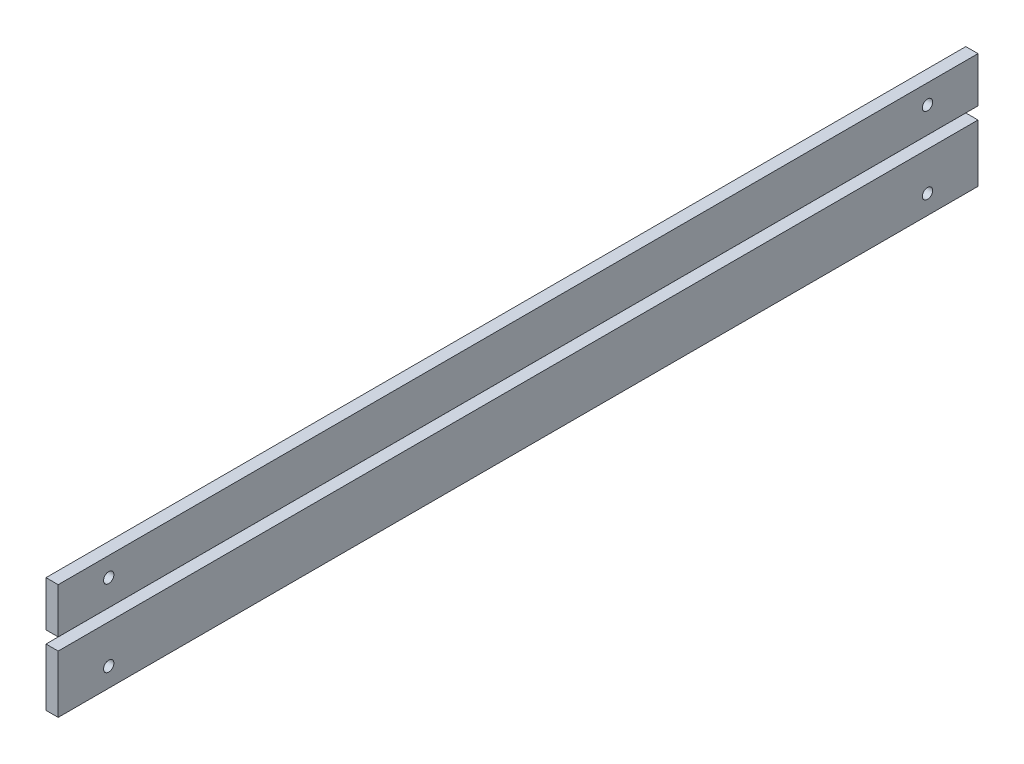
ISO-10303-21;
HEADER;
FILE_DESCRIPTION(('STEP AP214'),'2;1');
FILE_NAME('part.step','',(''),(''),'','','');
FILE_SCHEMA(('AUTOMOTIVE_DESIGN { 1 0 10303 214 1 1 1 1 }'));
ENDSEC;
DATA;
#1=APPLICATION_CONTEXT('core data for automotive mechanical design processes');
#2=APPLICATION_PROTOCOL_DEFINITION('international standard','automotive_design',2000,#1);
#3=PRODUCT_CONTEXT('',#1,'mechanical');
#4=PRODUCT('Part','Part','',(#3));
#5=PRODUCT_RELATED_PRODUCT_CATEGORY('part','',(#4));
#6=PRODUCT_DEFINITION_FORMATION('','',#4);
#7=PRODUCT_DEFINITION_CONTEXT('part definition',#1,'design');
#8=PRODUCT_DEFINITION('design','',#6,#7);
#9=PRODUCT_DEFINITION_SHAPE('','',#8);
#10=(LENGTH_UNIT() NAMED_UNIT(*) SI_UNIT(.MILLI.,.METRE.));
#11=(NAMED_UNIT(*) PLANE_ANGLE_UNIT() SI_UNIT($,.RADIAN.));
#12=(NAMED_UNIT(*) SI_UNIT($,.STERADIAN.) SOLID_ANGLE_UNIT());
#13=UNCERTAINTY_MEASURE_WITH_UNIT(LENGTH_MEASURE(1.E-05),#10,'distance_accuracy_value','');
#14=(GEOMETRIC_REPRESENTATION_CONTEXT(3) GLOBAL_UNCERTAINTY_ASSIGNED_CONTEXT((#13)) GLOBAL_UNIT_ASSIGNED_CONTEXT((#10,
#11,#12)) REPRESENTATION_CONTEXT('',''));
#15=CARTESIAN_POINT('',(0.,0.,0.));
#16=DIRECTION('',(0.,0.,1.));
#17=DIRECTION('',(1.,0.,0.));
#18=AXIS2_PLACEMENT_3D('',#15,#16,#17);
#19=CARTESIAN_POINT('',(3.18,15.,-120.));
#20=DIRECTION('',(0.,0.,1.));
#21=DIRECTION('',(1.,0.,0.));
#22=AXIS2_PLACEMENT_3D('',#19,#20,#21);
#23=PLANE('',#22);
#24=DIRECTION('',(0.,1.,0.));
#25=VECTOR('',#24,1.);
#26=CARTESIAN_POINT('',(3.18,15.,-120.));
#27=LINE('',#26,#25);
#28=CARTESIAN_POINT('',(3.18,3.19,-120.));
#29=VERTEX_POINT('',#28);
#30=CARTESIAN_POINT('',(3.18,15.,-120.));
#31=VERTEX_POINT('',#30);
#32=EDGE_CURVE('E93',#29,#31,#27,.T.);
#33=ORIENTED_EDGE('',*,*,#32,.F.);
#34=DIRECTION('',(1.,0.,0.));
#35=VECTOR('',#34,1.);
#36=CARTESIAN_POINT('',(-6.82,3.19,-120.));
#37=LINE('',#36,#35);
#38=CARTESIAN_POINT('',(0.,3.19,-120.));
#39=VERTEX_POINT('',#38);
#40=EDGE_CURVE('E55',#39,#29,#37,.T.);
#41=ORIENTED_EDGE('',*,*,#40,.F.);
#42=DIRECTION('',(0.,1.,0.));
#43=VECTOR('',#42,1.);
#44=CARTESIAN_POINT('',(0.,15.,-120.));
#45=LINE('',#44,#43);
#46=CARTESIAN_POINT('',(0.,15.,-120.));
#47=VERTEX_POINT('',#46);
#48=EDGE_CURVE('E49',#39,#47,#45,.T.);
#49=ORIENTED_EDGE('',*,*,#48,.T.);
#50=DIRECTION('',(-1.,0.,0.));
#51=VECTOR('',#50,1.);
#52=CARTESIAN_POINT('',(3.18,15.,-120.));
#53=LINE('',#52,#51);
#54=EDGE_CURVE('E102',#31,#47,#53,.T.);
#55=ORIENTED_EDGE('',*,*,#54,.F.);
#56=EDGE_LOOP('',(#33,#41,#49,#55));
#57=FACE_BOUND('',#56,.T.);
#58=ADVANCED_FACE('F46',(#57),#23,.F.);
#59=CARTESIAN_POINT('',(3.18,15.,120.));
#60=DIRECTION('',(0.,0.,-1.));
#61=DIRECTION('',(-1.,0.,0.));
#62=AXIS2_PLACEMENT_3D('',#59,#60,#61);
#63=PLANE('',#62);
#64=DIRECTION('',(0.,-1.,0.));
#65=VECTOR('',#64,1.);
#66=CARTESIAN_POINT('',(0.,15.,120.));
#67=LINE('',#66,#65);
#68=CARTESIAN_POINT('',(0.,15.,120.));
#69=VERTEX_POINT('',#68);
#70=CARTESIAN_POINT('',(0.,3.19,120.));
#71=VERTEX_POINT('',#70);
#72=EDGE_CURVE('E125',#69,#71,#67,.T.);
#73=ORIENTED_EDGE('',*,*,#72,.T.);
#74=DIRECTION('',(1.,0.,0.));
#75=VECTOR('',#74,1.);
#76=CARTESIAN_POINT('',(-6.82,3.19,120.));
#77=LINE('',#76,#75);
#78=CARTESIAN_POINT('',(3.18,3.19,120.));
#79=VERTEX_POINT('',#78);
#80=EDGE_CURVE('E114',#71,#79,#77,.T.);
#81=ORIENTED_EDGE('',*,*,#80,.T.);
#82=DIRECTION('',(0.,-1.,0.));
#83=VECTOR('',#82,1.);
#84=CARTESIAN_POINT('',(3.18,15.,120.));
#85=LINE('',#84,#83);
#86=CARTESIAN_POINT('',(3.18,15.,120.));
#87=VERTEX_POINT('',#86);
#88=EDGE_CURVE('E104',#87,#79,#85,.T.);
#89=ORIENTED_EDGE('',*,*,#88,.F.);
#90=DIRECTION('',(-1.,0.,0.));
#91=VECTOR('',#90,1.);
#92=CARTESIAN_POINT('',(3.18,15.,120.));
#93=LINE('',#92,#91);
#94=EDGE_CURVE('E99',#87,#69,#93,.T.);
#95=ORIENTED_EDGE('',*,*,#94,.T.);
#96=EDGE_LOOP('',(#73,#81,#89,#95));
#97=FACE_BOUND('',#96,.T.);
#98=ADVANCED_FACE('F130',(#97),#63,.F.);
#99=CARTESIAN_POINT('',(3.18,0.,0.));
#100=DIRECTION('',(1.,0.,0.));
#101=DIRECTION('',(0.,0.,-1.));
#102=AXIS2_PLACEMENT_3D('',#99,#100,#101);
#103=PLANE('',#102);
#104=DIRECTION('',(0.,0.,1.));
#105=VECTOR('',#104,1.);
#106=CARTESIAN_POINT('',(3.18,3.19,120.));
#107=LINE('',#106,#105);
#108=EDGE_CURVE('E12',#29,#79,#107,.T.);
#109=ORIENTED_EDGE('',*,*,#108,.F.);
#110=ORIENTED_EDGE('',*,*,#32,.T.);
#111=DIRECTION('',(0.,0.,1.));
#112=VECTOR('',#111,1.);
#113=CARTESIAN_POINT('',(3.18,15.,120.));
#114=LINE('',#113,#112);
#115=EDGE_CURVE('E98',#31,#87,#114,.T.);
#116=ORIENTED_EDGE('',*,*,#115,.T.);
#117=ORIENTED_EDGE('',*,*,#88,.T.);
#118=EDGE_LOOP('',(#109,#110,#116,#117));
#119=FACE_BOUND('',#118,.T.);
#120=CARTESIAN_POINT('',(3.18,10.,-106.82));
#121=DIRECTION('',(1.,0.,0.));
#122=DIRECTION('',(0.,0.,-1.));
#123=AXIS2_PLACEMENT_3D('',#120,#121,#122);
#124=CIRCLE('',#123,1.35000000000001);
#125=CARTESIAN_POINT('',(3.18,10.,-105.47));
#126=VERTEX_POINT('',#125);
#127=EDGE_CURVE('E116',#126,#126,#124,.F.);
#128=ORIENTED_EDGE('',*,*,#127,.T.);
#129=EDGE_LOOP('',(#128));
#130=FACE_BOUND('',#129,.T.);
#131=CARTESIAN_POINT('',(3.18,10.,106.82));
#132=DIRECTION('',(1.,0.,0.));
#133=DIRECTION('',(0.,0.,-1.));
#134=AXIS2_PLACEMENT_3D('',#131,#132,#133);
#135=CIRCLE('',#134,1.35000000000001);
#136=CARTESIAN_POINT('',(3.18,10.,108.17));
#137=VERTEX_POINT('',#136);
#138=EDGE_CURVE('E109',#137,#137,#135,.T.);
#139=ORIENTED_EDGE('',*,*,#138,.F.);
#140=EDGE_LOOP('',(#139));
#141=FACE_BOUND('',#140,.T.);
#142=ADVANCED_FACE('F95',(#119,#130,#141),#103,.T.);
#143=CARTESIAN_POINT('',(0.,0.,0.));
#144=DIRECTION('',(1.,0.,0.));
#145=DIRECTION('',(0.,0.,-1.));
#146=AXIS2_PLACEMENT_3D('',#143,#144,#145);
#147=PLANE('',#146);
#148=CARTESIAN_POINT('',(0.,10.,-106.82));
#149=DIRECTION('',(-1.,0.,0.));
#150=DIRECTION('',(0.,0.,1.));
#151=AXIS2_PLACEMENT_3D('',#148,#149,#150);
#152=CIRCLE('',#151,1.35000000000001);
#153=CARTESIAN_POINT('',(0.,10.,-105.47));
#154=VERTEX_POINT('',#153);
#155=EDGE_CURVE('E106',#154,#154,#152,.T.);
#156=ORIENTED_EDGE('',*,*,#155,.F.);
#157=EDGE_LOOP('',(#156));
#158=FACE_BOUND('',#157,.T.);
#159=CARTESIAN_POINT('',(0.,10.,106.82));
#160=DIRECTION('',(1.,0.,0.));
#161=DIRECTION('',(0.,0.,-1.));
#162=AXIS2_PLACEMENT_3D('',#159,#160,#161);
#163=CIRCLE('',#162,1.35000000000001);
#164=CARTESIAN_POINT('',(0.,10.,108.17));
#165=VERTEX_POINT('',#164);
#166=EDGE_CURVE('E118',#165,#165,#163,.T.);
#167=ORIENTED_EDGE('',*,*,#166,.T.);
#168=EDGE_LOOP('',(#167));
#169=FACE_BOUND('',#168,.T.);
#170=ORIENTED_EDGE('',*,*,#48,.F.);
#171=DIRECTION('',(0.,0.,1.));
#172=VECTOR('',#171,1.);
#173=CARTESIAN_POINT('',(0.,3.19,0.));
#174=LINE('',#173,#172);
#175=EDGE_CURVE('E64',#39,#71,#174,.T.);
#176=ORIENTED_EDGE('',*,*,#175,.T.);
#177=ORIENTED_EDGE('',*,*,#72,.F.);
#178=DIRECTION('',(0.,0.,1.));
#179=VECTOR('',#178,1.);
#180=CARTESIAN_POINT('',(0.,15.,120.));
#181=LINE('',#180,#179);
#182=EDGE_CURVE('E81',#47,#69,#181,.T.);
#183=ORIENTED_EDGE('',*,*,#182,.F.);
#184=EDGE_LOOP('',(#170,#176,#177,#183));
#185=FACE_BOUND('',#184,.T.);
#186=ADVANCED_FACE('F132',(#158,#169,#185),#147,.F.);
#187=CARTESIAN_POINT('',(3.18,15.,120.));
#188=DIRECTION('',(0.,-1.,0.));
#189=DIRECTION('',(0.,0.,-1.));
#190=AXIS2_PLACEMENT_3D('',#187,#188,#189);
#191=PLANE('',#190);
#192=ORIENTED_EDGE('',*,*,#182,.T.);
#193=ORIENTED_EDGE('',*,*,#94,.F.);
#194=ORIENTED_EDGE('',*,*,#115,.F.);
#195=ORIENTED_EDGE('',*,*,#54,.T.);
#196=EDGE_LOOP('',(#192,#193,#194,#195));
#197=FACE_BOUND('',#196,.T.);
#198=ADVANCED_FACE('F101',(#197),#191,.F.);
#199=CARTESIAN_POINT('',(3.181,10.,-106.82));
#200=DIRECTION('',(-1.,0.,0.));
#201=DIRECTION('',(0.,0.,1.));
#202=AXIS2_PLACEMENT_3D('',#199,#200,#201);
#203=CYLINDRICAL_SURFACE('',#202,1.35000000000001);
#204=CARTESIAN_POINT('',(3.18,10.,-105.47));
#205=CARTESIAN_POINT('',(3.146875,10.,-105.47));
#206=CARTESIAN_POINT('',(3.11375,10.,-105.47));
#207=CARTESIAN_POINT('',(3.0475,10.,-105.47));
#208=CARTESIAN_POINT('',(3.014375,10.,-105.47));
#209=CARTESIAN_POINT('',(2.948125,10.,-105.47));
#210=CARTESIAN_POINT('',(2.915,10.,-105.47));
#211=CARTESIAN_POINT('',(2.84875,10.,-105.47));
#212=CARTESIAN_POINT('',(2.815625,10.,-105.47));
#213=CARTESIAN_POINT('',(2.749375,10.,-105.47));
#214=CARTESIAN_POINT('',(2.71625,10.,-105.47));
#215=CARTESIAN_POINT('',(2.65,10.,-105.47));
#216=CARTESIAN_POINT('',(2.616875,10.,-105.47));
#217=CARTESIAN_POINT('',(2.550625,10.,-105.47));
#218=CARTESIAN_POINT('',(2.5175,10.,-105.47));
#219=CARTESIAN_POINT('',(2.45125,10.,-105.47));
#220=CARTESIAN_POINT('',(2.418125,10.,-105.47));
#221=CARTESIAN_POINT('',(2.351875,10.,-105.47));
#222=CARTESIAN_POINT('',(2.31875,10.,-105.47));
#223=CARTESIAN_POINT('',(2.2525,10.,-105.47));
#224=CARTESIAN_POINT('',(2.219375,10.,-105.47));
#225=CARTESIAN_POINT('',(2.153125,10.,-105.47));
#226=CARTESIAN_POINT('',(2.12,10.,-105.47));
#227=CARTESIAN_POINT('',(2.05375,10.,-105.47));
#228=CARTESIAN_POINT('',(2.020625,10.,-105.47));
#229=CARTESIAN_POINT('',(1.954375,10.,-105.47));
#230=CARTESIAN_POINT('',(1.92125,10.,-105.47));
#231=CARTESIAN_POINT('',(1.855,10.,-105.47));
#232=CARTESIAN_POINT('',(1.821875,10.,-105.47));
#233=CARTESIAN_POINT('',(1.755625,10.,-105.47));
#234=CARTESIAN_POINT('',(1.7225,10.,-105.47));
#235=CARTESIAN_POINT('',(1.65625,10.,-105.47));
#236=CARTESIAN_POINT('',(1.623125,10.,-105.47));
#237=CARTESIAN_POINT('',(1.556875,10.,-105.47));
#238=CARTESIAN_POINT('',(1.52375,10.,-105.47));
#239=CARTESIAN_POINT('',(1.4575,10.,-105.47));
#240=CARTESIAN_POINT('',(1.424375,10.,-105.47));
#241=CARTESIAN_POINT('',(1.358125,10.,-105.47));
#242=CARTESIAN_POINT('',(1.325,10.,-105.47));
#243=CARTESIAN_POINT('',(1.25875,10.,-105.47));
#244=CARTESIAN_POINT('',(1.225625,10.,-105.47));
#245=CARTESIAN_POINT('',(1.159375,10.,-105.47));
#246=CARTESIAN_POINT('',(1.12625,10.,-105.47));
#247=CARTESIAN_POINT('',(1.06,10.,-105.47));
#248=CARTESIAN_POINT('',(1.026875,10.,-105.47));
#249=CARTESIAN_POINT('',(0.960625,10.,-105.47));
#250=CARTESIAN_POINT('',(0.9275,10.,-105.47));
#251=CARTESIAN_POINT('',(0.86125,10.,-105.47));
#252=CARTESIAN_POINT('',(0.828125,10.,-105.47));
#253=CARTESIAN_POINT('',(0.761875,10.,-105.47));
#254=CARTESIAN_POINT('',(0.72875,10.,-105.47));
#255=CARTESIAN_POINT('',(0.6625,10.,-105.47));
#256=CARTESIAN_POINT('',(0.629375,10.,-105.47));
#257=CARTESIAN_POINT('',(0.563125,10.,-105.47));
#258=CARTESIAN_POINT('',(0.53,10.,-105.47));
#259=CARTESIAN_POINT('',(0.46375,10.,-105.47));
#260=CARTESIAN_POINT('',(0.430625,10.,-105.47));
#261=CARTESIAN_POINT('',(0.364375,10.,-105.47));
#262=CARTESIAN_POINT('',(0.33125,10.,-105.47));
#263=CARTESIAN_POINT('',(0.265,10.,-105.47));
#264=CARTESIAN_POINT('',(0.231875,10.,-105.47));
#265=CARTESIAN_POINT('',(0.165625,10.,-105.47));
#266=CARTESIAN_POINT('',(0.1325,10.,-105.47));
#267=CARTESIAN_POINT('',(0.0662499999999998,10.,-105.47));
#268=CARTESIAN_POINT('',(0.0331249999999999,10.,-105.47));
#269=CARTESIAN_POINT('',(0.,10.,-105.47));
#270=B_SPLINE_CURVE_WITH_KNOTS('',3,(#204,#205,#206,#207,#208,#209,#210,#211,#212,#213,#214,
#215,#216,#217,#218,#219,#220,#221,#222,#223,#224,#225,#226,#227,#228,#229,#230,#231,#232,#233,
#234,#235,#236,#237,#238,#239,#240,#241,#242,#243,#244,#245,#246,#247,#248,#249,#250,#251,#252,
#253,#254,#255,#256,#257,#258,#259,#260,#261,#262,#263,#264,#265,#266,#267,#268,#269),
.UNSPECIFIED.,.F.,.F.,(4,2,2,2,2,2,2,2,2,2,2,2,2,2,2,2,2,2,2,2,2,2,2,2,2,2,2,2,2,2,2,2,4),(0.,
0.0993750000000001,0.19875,0.298125,0.3975,0.496875,0.59625,0.695625,0.795,0.894375,0.99375,
1.093125,1.1925,1.291875,1.39125,1.490625,1.59,1.689375,1.78875,1.888125,1.9875,2.086875,
2.18625,2.285625,2.385,2.484375,2.58375,2.683125,2.7825,2.881875,2.98125,3.080625,3.18),.UNSPECIFIED.);
#271=EDGE_CURVE('BSEAM140',#126,#154,#270,.T.);
#272=ORIENTED_EDGE('',*,*,#127,.F.);
#273=ORIENTED_EDGE('',*,*,#155,.T.);
#274=ORIENTED_EDGE('',*,*,#271,.T.);
#275=ORIENTED_EDGE('',*,*,#271,.F.);
#276=EDGE_LOOP('',(#272,#274,#273,#275));
#277=FACE_BOUND('',#276,.T.);
#278=ADVANCED_FACE('F140',(#277),#203,.F.);
#279=CARTESIAN_POINT('',(3.181,10.,106.82));
#280=DIRECTION('',(-1.,0.,0.));
#281=DIRECTION('',(0.,0.,1.));
#282=AXIS2_PLACEMENT_3D('',#279,#280,#281);
#283=CYLINDRICAL_SURFACE('',#282,1.35000000000001);
#284=CARTESIAN_POINT('',(3.18,10.,108.17));
#285=CARTESIAN_POINT('',(3.146875,10.,108.17));
#286=CARTESIAN_POINT('',(3.11375,10.,108.17));
#287=CARTESIAN_POINT('',(3.0475,10.,108.17));
#288=CARTESIAN_POINT('',(3.014375,10.,108.17));
#289=CARTESIAN_POINT('',(2.948125,10.,108.17));
#290=CARTESIAN_POINT('',(2.915,10.,108.17));
#291=CARTESIAN_POINT('',(2.84875,10.,108.17));
#292=CARTESIAN_POINT('',(2.815625,10.,108.17));
#293=CARTESIAN_POINT('',(2.749375,10.,108.17));
#294=CARTESIAN_POINT('',(2.71625,10.,108.17));
#295=CARTESIAN_POINT('',(2.65,10.,108.17));
#296=CARTESIAN_POINT('',(2.616875,10.,108.17));
#297=CARTESIAN_POINT('',(2.550625,10.,108.17));
#298=CARTESIAN_POINT('',(2.5175,10.,108.17));
#299=CARTESIAN_POINT('',(2.45125,10.,108.17));
#300=CARTESIAN_POINT('',(2.418125,10.,108.17));
#301=CARTESIAN_POINT('',(2.351875,10.,108.17));
#302=CARTESIAN_POINT('',(2.31875,10.,108.17));
#303=CARTESIAN_POINT('',(2.2525,10.,108.17));
#304=CARTESIAN_POINT('',(2.219375,10.,108.17));
#305=CARTESIAN_POINT('',(2.153125,10.,108.17));
#306=CARTESIAN_POINT('',(2.12,10.,108.17));
#307=CARTESIAN_POINT('',(2.05375,10.,108.17));
#308=CARTESIAN_POINT('',(2.020625,10.,108.17));
#309=CARTESIAN_POINT('',(1.954375,10.,108.17));
#310=CARTESIAN_POINT('',(1.92125,10.,108.17));
#311=CARTESIAN_POINT('',(1.855,10.,108.17));
#312=CARTESIAN_POINT('',(1.821875,10.,108.17));
#313=CARTESIAN_POINT('',(1.755625,10.,108.17));
#314=CARTESIAN_POINT('',(1.7225,10.,108.17));
#315=CARTESIAN_POINT('',(1.65625,10.,108.17));
#316=CARTESIAN_POINT('',(1.623125,10.,108.17));
#317=CARTESIAN_POINT('',(1.556875,10.,108.17));
#318=CARTESIAN_POINT('',(1.52375,10.,108.17));
#319=CARTESIAN_POINT('',(1.4575,10.,108.17));
#320=CARTESIAN_POINT('',(1.424375,10.,108.17));
#321=CARTESIAN_POINT('',(1.358125,10.,108.17));
#322=CARTESIAN_POINT('',(1.325,10.,108.17));
#323=CARTESIAN_POINT('',(1.25875,10.,108.17));
#324=CARTESIAN_POINT('',(1.225625,10.,108.17));
#325=CARTESIAN_POINT('',(1.159375,10.,108.17));
#326=CARTESIAN_POINT('',(1.12625,10.,108.17));
#327=CARTESIAN_POINT('',(1.06,10.,108.17));
#328=CARTESIAN_POINT('',(1.026875,10.,108.17));
#329=CARTESIAN_POINT('',(0.960625,10.,108.17));
#330=CARTESIAN_POINT('',(0.9275,10.,108.17));
#331=CARTESIAN_POINT('',(0.86125,10.,108.17));
#332=CARTESIAN_POINT('',(0.828125,10.,108.17));
#333=CARTESIAN_POINT('',(0.761875,10.,108.17));
#334=CARTESIAN_POINT('',(0.72875,10.,108.17));
#335=CARTESIAN_POINT('',(0.6625,10.,108.17));
#336=CARTESIAN_POINT('',(0.629375,10.,108.17));
#337=CARTESIAN_POINT('',(0.563125,10.,108.17));
#338=CARTESIAN_POINT('',(0.53,10.,108.17));
#339=CARTESIAN_POINT('',(0.46375,10.,108.17));
#340=CARTESIAN_POINT('',(0.430625,10.,108.17));
#341=CARTESIAN_POINT('',(0.364375,10.,108.17));
#342=CARTESIAN_POINT('',(0.33125,10.,108.17));
#343=CARTESIAN_POINT('',(0.265,10.,108.17));
#344=CARTESIAN_POINT('',(0.231875,10.,108.17));
#345=CARTESIAN_POINT('',(0.165625,10.,108.17));
#346=CARTESIAN_POINT('',(0.1325,10.,108.17));
#347=CARTESIAN_POINT('',(0.0662499999999998,10.,108.17));
#348=CARTESIAN_POINT('',(0.0331249999999999,10.,108.17));
#349=CARTESIAN_POINT('',(0.,10.,108.17));
#350=B_SPLINE_CURVE_WITH_KNOTS('',3,(#284,#285,#286,#287,#288,#289,#290,#291,#292,#293,#294,
#295,#296,#297,#298,#299,#300,#301,#302,#303,#304,#305,#306,#307,#308,#309,#310,#311,#312,#313,
#314,#315,#316,#317,#318,#319,#320,#321,#322,#323,#324,#325,#326,#327,#328,#329,#330,#331,#332,
#333,#334,#335,#336,#337,#338,#339,#340,#341,#342,#343,#344,#345,#346,#347,#348,#349),
.UNSPECIFIED.,.F.,.F.,(4,2,2,2,2,2,2,2,2,2,2,2,2,2,2,2,2,2,2,2,2,2,2,2,2,2,2,2,2,2,2,2,4),(0.,
0.0993750000000001,0.19875,0.298125,0.3975,0.496875,0.59625,0.695625,0.795,0.894375,0.99375,
1.093125,1.1925,1.291875,1.39125,1.490625,1.59,1.689375,1.78875,1.888125,1.9875,2.086875,
2.18625,2.285625,2.385,2.484375,2.58375,2.683125,2.7825,2.881875,2.98125,3.080625,3.18),.UNSPECIFIED.);
#351=EDGE_CURVE('BSEAM175',#137,#165,#350,.T.);
#352=ORIENTED_EDGE('',*,*,#138,.T.);
#353=ORIENTED_EDGE('',*,*,#166,.F.);
#354=ORIENTED_EDGE('',*,*,#351,.T.);
#355=ORIENTED_EDGE('',*,*,#351,.F.);
#356=EDGE_LOOP('',(#352,#354,#353,#355));
#357=FACE_BOUND('',#356,.T.);
#358=ADVANCED_FACE('F175',(#357),#283,.F.);
#359=CARTESIAN_POINT('',(-6.82,3.19,120.));
#360=DIRECTION('',(0.,1.,0.));
#361=DIRECTION('',(0.,0.,1.));
#362=AXIS2_PLACEMENT_3D('',#359,#360,#361);
#363=PLANE('',#362);
#364=ORIENTED_EDGE('',*,*,#40,.T.);
#365=ORIENTED_EDGE('',*,*,#108,.T.);
#366=ORIENTED_EDGE('',*,*,#80,.F.);
#367=ORIENTED_EDGE('',*,*,#175,.F.);
#368=EDGE_LOOP('',(#364,#365,#366,#367));
#369=FACE_BOUND('',#368,.T.);
#370=ADVANCED_FACE('F185',(#369),#363,.F.);
#371=CLOSED_SHELL('',(#58,#98,#142,#186,#198,#278,#358,#370));
#372=MANIFOLD_SOLID_BREP('B2',#371);
#373=CARTESIAN_POINT('',(3.18,-15.,120.));
#374=DIRECTION('',(0.,1.,0.));
#375=DIRECTION('',(0.,0.,1.));
#376=AXIS2_PLACEMENT_3D('',#373,#374,#375);
#377=PLANE('',#376);
#378=DIRECTION('',(0.,0.,-1.));
#379=VECTOR('',#378,1.);
#380=CARTESIAN_POINT('',(0.,-15.,120.));
#381=LINE('',#380,#379);
#382=CARTESIAN_POINT('',(0.,-15.,120.));
#383=VERTEX_POINT('',#382);
#384=CARTESIAN_POINT('',(0.,-15.,-120.));
#385=VERTEX_POINT('',#384);
#386=EDGE_CURVE('E247',#383,#385,#381,.T.);
#387=ORIENTED_EDGE('',*,*,#386,.T.);
#388=DIRECTION('',(-1.,0.,0.));
#389=VECTOR('',#388,1.);
#390=CARTESIAN_POINT('',(3.18,-15.,-120.));
#391=LINE('',#390,#389);
#392=CARTESIAN_POINT('',(3.18,-15.,-120.));
#393=VERTEX_POINT('',#392);
#394=EDGE_CURVE('E249',#393,#385,#391,.T.);
#395=ORIENTED_EDGE('',*,*,#394,.F.);
#396=DIRECTION('',(0.,0.,-1.));
#397=VECTOR('',#396,1.);
#398=CARTESIAN_POINT('',(3.18,-15.,120.));
#399=LINE('',#398,#397);
#400=CARTESIAN_POINT('',(3.18,-15.,120.));
#401=VERTEX_POINT('',#400);
#402=EDGE_CURVE('E234',#401,#393,#399,.T.);
#403=ORIENTED_EDGE('',*,*,#402,.F.);
#404=DIRECTION('',(-1.,0.,0.));
#405=VECTOR('',#404,1.);
#406=CARTESIAN_POINT('',(3.18,-15.,120.));
#407=LINE('',#406,#405);
#408=EDGE_CURVE('E219',#401,#383,#407,.T.);
#409=ORIENTED_EDGE('',*,*,#408,.T.);
#410=EDGE_LOOP('',(#387,#395,#403,#409));
#411=FACE_BOUND('',#410,.T.);
#412=ADVANCED_FACE('F211',(#411),#377,.F.);
#413=CARTESIAN_POINT('',(3.181,-10.,-106.82));
#414=DIRECTION('',(-1.,0.,0.));
#415=DIRECTION('',(0.,0.,1.));
#416=AXIS2_PLACEMENT_3D('',#413,#414,#415);
#417=CYLINDRICAL_SURFACE('',#416,1.35000000000001);
#418=CARTESIAN_POINT('',(3.18,-10.,-106.82));
#419=DIRECTION('',(1.,0.,0.));
#420=DIRECTION('',(0.,0.,-1.));
#421=AXIS2_PLACEMENT_3D('',#418,#419,#420);
#422=CIRCLE('',#421,1.35000000000001);
#423=CARTESIAN_POINT('',(3.18,-10.,-105.47));
#424=VERTEX_POINT('',#423);
#425=EDGE_CURVE('E263',#424,#424,#422,.T.);
#426=CARTESIAN_POINT('',(0.,-10.,-106.82));
#427=DIRECTION('',(1.,0.,0.));
#428=DIRECTION('',(0.,0.,1.));
#429=AXIS2_PLACEMENT_3D('',#426,#427,#428);
#430=CIRCLE('',#429,1.35000000000001);
#431=CARTESIAN_POINT('',(0.,-10.,-105.47));
#432=VERTEX_POINT('',#431);
#433=EDGE_CURVE('E267',#432,#432,#430,.T.);
#434=CARTESIAN_POINT('',(3.18,-10.,-105.47));
#435=CARTESIAN_POINT('',(3.146875,-10.,-105.47));
#436=CARTESIAN_POINT('',(3.11375,-10.,-105.47));
#437=CARTESIAN_POINT('',(3.0475,-10.,-105.47));
#438=CARTESIAN_POINT('',(3.014375,-10.,-105.47));
#439=CARTESIAN_POINT('',(2.948125,-10.,-105.47));
#440=CARTESIAN_POINT('',(2.915,-10.,-105.47));
#441=CARTESIAN_POINT('',(2.84875,-10.,-105.47));
#442=CARTESIAN_POINT('',(2.815625,-10.,-105.47));
#443=CARTESIAN_POINT('',(2.749375,-10.,-105.47));
#444=CARTESIAN_POINT('',(2.71625,-10.,-105.47));
#445=CARTESIAN_POINT('',(2.65,-10.,-105.47));
#446=CARTESIAN_POINT('',(2.616875,-10.,-105.47));
#447=CARTESIAN_POINT('',(2.550625,-10.,-105.47));
#448=CARTESIAN_POINT('',(2.5175,-10.,-105.47));
#449=CARTESIAN_POINT('',(2.45125,-10.,-105.47));
#450=CARTESIAN_POINT('',(2.418125,-10.,-105.47));
#451=CARTESIAN_POINT('',(2.351875,-10.,-105.47));
#452=CARTESIAN_POINT('',(2.31875,-10.,-105.47));
#453=CARTESIAN_POINT('',(2.2525,-10.,-105.47));
#454=CARTESIAN_POINT('',(2.219375,-10.,-105.47));
#455=CARTESIAN_POINT('',(2.153125,-10.,-105.47));
#456=CARTESIAN_POINT('',(2.12,-10.,-105.47));
#457=CARTESIAN_POINT('',(2.05375,-10.,-105.47));
#458=CARTESIAN_POINT('',(2.020625,-10.,-105.47));
#459=CARTESIAN_POINT('',(1.954375,-10.,-105.47));
#460=CARTESIAN_POINT('',(1.92125,-10.,-105.47));
#461=CARTESIAN_POINT('',(1.855,-10.,-105.47));
#462=CARTESIAN_POINT('',(1.821875,-10.,-105.47));
#463=CARTESIAN_POINT('',(1.755625,-10.,-105.47));
#464=CARTESIAN_POINT('',(1.7225,-10.,-105.47));
#465=CARTESIAN_POINT('',(1.65625,-10.,-105.47));
#466=CARTESIAN_POINT('',(1.623125,-10.,-105.47));
#467=CARTESIAN_POINT('',(1.556875,-10.,-105.47));
#468=CARTESIAN_POINT('',(1.52375,-10.,-105.47));
#469=CARTESIAN_POINT('',(1.4575,-10.,-105.47));
#470=CARTESIAN_POINT('',(1.424375,-10.,-105.47));
#471=CARTESIAN_POINT('',(1.358125,-10.,-105.47));
#472=CARTESIAN_POINT('',(1.325,-10.,-105.47));
#473=CARTESIAN_POINT('',(1.25875,-10.,-105.47));
#474=CARTESIAN_POINT('',(1.225625,-10.,-105.47));
#475=CARTESIAN_POINT('',(1.159375,-10.,-105.47));
#476=CARTESIAN_POINT('',(1.12625,-10.,-105.47));
#477=CARTESIAN_POINT('',(1.06,-10.,-105.47));
#478=CARTESIAN_POINT('',(1.026875,-10.,-105.47));
#479=CARTESIAN_POINT('',(0.960625,-10.,-105.47));
#480=CARTESIAN_POINT('',(0.9275,-10.,-105.47));
#481=CARTESIAN_POINT('',(0.86125,-10.,-105.47));
#482=CARTESIAN_POINT('',(0.828125,-10.,-105.47));
#483=CARTESIAN_POINT('',(0.761875,-10.,-105.47));
#484=CARTESIAN_POINT('',(0.72875,-10.,-105.47));
#485=CARTESIAN_POINT('',(0.6625,-10.,-105.47));
#486=CARTESIAN_POINT('',(0.629375,-10.,-105.47));
#487=CARTESIAN_POINT('',(0.563125,-10.,-105.47));
#488=CARTESIAN_POINT('',(0.53,-10.,-105.47));
#489=CARTESIAN_POINT('',(0.46375,-10.,-105.47));
#490=CARTESIAN_POINT('',(0.430625,-10.,-105.47));
#491=CARTESIAN_POINT('',(0.364375,-10.,-105.47));
#492=CARTESIAN_POINT('',(0.33125,-10.,-105.47));
#493=CARTESIAN_POINT('',(0.265,-10.,-105.47));
#494=CARTESIAN_POINT('',(0.231875,-10.,-105.47));
#495=CARTESIAN_POINT('',(0.165625,-10.,-105.47));
#496=CARTESIAN_POINT('',(0.1325,-10.,-105.47));
#497=CARTESIAN_POINT('',(0.0662499999999998,-10.,-105.47));
#498=CARTESIAN_POINT('',(0.0331249999999999,-10.,-105.47));
#499=CARTESIAN_POINT('',(0.,-10.,-105.47));
#500=B_SPLINE_CURVE_WITH_KNOTS('',3,(#434,#435,#436,#437,#438,#439,#440,#441,#442,#443,#444,
#445,#446,#447,#448,#449,#450,#451,#452,#453,#454,#455,#456,#457,#458,#459,#460,#461,#462,#463,
#464,#465,#466,#467,#468,#469,#470,#471,#472,#473,#474,#475,#476,#477,#478,#479,#480,#481,#482,
#483,#484,#485,#486,#487,#488,#489,#490,#491,#492,#493,#494,#495,#496,#497,#498,#499),
.UNSPECIFIED.,.F.,.F.,(4,2,2,2,2,2,2,2,2,2,2,2,2,2,2,2,2,2,2,2,2,2,2,2,2,2,2,2,2,2,2,2,4),(0.,
0.0993750000000001,0.19875,0.298125,0.3975,0.496875,0.59625,0.695625,0.795,0.894375,0.99375,
1.093125,1.1925,1.291875,1.39125,1.490625,1.59,1.689375,1.78875,1.888125,1.9875,2.086875,
2.18625,2.285625,2.385,2.484375,2.58375,2.683125,2.7825,2.881875,2.98125,3.080625,3.18),.UNSPECIFIED.);
#501=EDGE_CURVE('BSEAM303',#424,#432,#500,.T.);
#502=ORIENTED_EDGE('',*,*,#425,.T.);
#503=ORIENTED_EDGE('',*,*,#433,.F.);
#504=ORIENTED_EDGE('',*,*,#501,.T.);
#505=ORIENTED_EDGE('',*,*,#501,.F.);
#506=EDGE_LOOP('',(#502,#504,#503,#505));
#507=FACE_BOUND('',#506,.T.);
#508=ADVANCED_FACE('F303',(#507),#417,.F.);
#509=CARTESIAN_POINT('',(3.181,-10.,106.82));
#510=DIRECTION('',(-1.,0.,0.));
#511=DIRECTION('',(0.,0.,1.));
#512=AXIS2_PLACEMENT_3D('',#509,#510,#511);
#513=CYLINDRICAL_SURFACE('',#512,1.35000000000001);
#514=CARTESIAN_POINT('',(3.18,-10.,106.82));
#515=DIRECTION('',(1.,0.,0.));
#516=DIRECTION('',(0.,0.,-1.));
#517=AXIS2_PLACEMENT_3D('',#514,#515,#516);
#518=CIRCLE('',#517,1.35000000000001);
#519=CARTESIAN_POINT('',(3.18,-10.,108.17));
#520=VERTEX_POINT('',#519);
#521=EDGE_CURVE('E277',#520,#520,#518,.F.);
#522=CARTESIAN_POINT('',(0.,-10.,106.82));
#523=DIRECTION('',(-1.,0.,0.));
#524=DIRECTION('',(0.,0.,-1.));
#525=AXIS2_PLACEMENT_3D('',#522,#523,#524);
#526=CIRCLE('',#525,1.35000000000001);
#527=CARTESIAN_POINT('',(0.,-10.,108.17));
#528=VERTEX_POINT('',#527);
#529=EDGE_CURVE('E276',#528,#528,#526,.T.);
#530=CARTESIAN_POINT('',(3.18,-10.,108.17));
#531=CARTESIAN_POINT('',(3.146875,-10.,108.17));
#532=CARTESIAN_POINT('',(3.11375,-10.,108.17));
#533=CARTESIAN_POINT('',(3.0475,-10.,108.17));
#534=CARTESIAN_POINT('',(3.014375,-10.,108.17));
#535=CARTESIAN_POINT('',(2.948125,-10.,108.17));
#536=CARTESIAN_POINT('',(2.915,-10.,108.17));
#537=CARTESIAN_POINT('',(2.84875,-10.,108.17));
#538=CARTESIAN_POINT('',(2.815625,-10.,108.17));
#539=CARTESIAN_POINT('',(2.749375,-10.,108.17));
#540=CARTESIAN_POINT('',(2.71625,-10.,108.17));
#541=CARTESIAN_POINT('',(2.65,-10.,108.17));
#542=CARTESIAN_POINT('',(2.616875,-10.,108.17));
#543=CARTESIAN_POINT('',(2.550625,-10.,108.17));
#544=CARTESIAN_POINT('',(2.5175,-10.,108.17));
#545=CARTESIAN_POINT('',(2.45125,-10.,108.17));
#546=CARTESIAN_POINT('',(2.418125,-10.,108.17));
#547=CARTESIAN_POINT('',(2.351875,-10.,108.17));
#548=CARTESIAN_POINT('',(2.31875,-10.,108.17));
#549=CARTESIAN_POINT('',(2.2525,-10.,108.17));
#550=CARTESIAN_POINT('',(2.219375,-10.,108.17));
#551=CARTESIAN_POINT('',(2.153125,-10.,108.17));
#552=CARTESIAN_POINT('',(2.12,-10.,108.17));
#553=CARTESIAN_POINT('',(2.05375,-10.,108.17));
#554=CARTESIAN_POINT('',(2.020625,-10.,108.17));
#555=CARTESIAN_POINT('',(1.954375,-10.,108.17));
#556=CARTESIAN_POINT('',(1.92125,-10.,108.17));
#557=CARTESIAN_POINT('',(1.855,-10.,108.17));
#558=CARTESIAN_POINT('',(1.821875,-10.,108.17));
#559=CARTESIAN_POINT('',(1.755625,-10.,108.17));
#560=CARTESIAN_POINT('',(1.7225,-10.,108.17));
#561=CARTESIAN_POINT('',(1.65625,-10.,108.17));
#562=CARTESIAN_POINT('',(1.623125,-10.,108.17));
#563=CARTESIAN_POINT('',(1.556875,-10.,108.17));
#564=CARTESIAN_POINT('',(1.52375,-10.,108.17));
#565=CARTESIAN_POINT('',(1.4575,-10.,108.17));
#566=CARTESIAN_POINT('',(1.424375,-10.,108.17));
#567=CARTESIAN_POINT('',(1.358125,-10.,108.17));
#568=CARTESIAN_POINT('',(1.325,-10.,108.17));
#569=CARTESIAN_POINT('',(1.25875,-10.,108.17));
#570=CARTESIAN_POINT('',(1.225625,-10.,108.17));
#571=CARTESIAN_POINT('',(1.159375,-10.,108.17));
#572=CARTESIAN_POINT('',(1.12625,-10.,108.17));
#573=CARTESIAN_POINT('',(1.06,-10.,108.17));
#574=CARTESIAN_POINT('',(1.026875,-10.,108.17));
#575=CARTESIAN_POINT('',(0.960625,-10.,108.17));
#576=CARTESIAN_POINT('',(0.9275,-10.,108.17));
#577=CARTESIAN_POINT('',(0.86125,-10.,108.17));
#578=CARTESIAN_POINT('',(0.828125,-10.,108.17));
#579=CARTESIAN_POINT('',(0.761875,-10.,108.17));
#580=CARTESIAN_POINT('',(0.72875,-10.,108.17));
#581=CARTESIAN_POINT('',(0.6625,-10.,108.17));
#582=CARTESIAN_POINT('',(0.629375,-10.,108.17));
#583=CARTESIAN_POINT('',(0.563125,-10.,108.17));
#584=CARTESIAN_POINT('',(0.53,-10.,108.17));
#585=CARTESIAN_POINT('',(0.46375,-10.,108.17));
#586=CARTESIAN_POINT('',(0.430625,-10.,108.17));
#587=CARTESIAN_POINT('',(0.364375,-10.,108.17));
#588=CARTESIAN_POINT('',(0.33125,-10.,108.17));
#589=CARTESIAN_POINT('',(0.265,-10.,108.17));
#590=CARTESIAN_POINT('',(0.231875,-10.,108.17));
#591=CARTESIAN_POINT('',(0.165625,-10.,108.17));
#592=CARTESIAN_POINT('',(0.1325,-10.,108.17));
#593=CARTESIAN_POINT('',(0.0662499999999998,-10.,108.17));
#594=CARTESIAN_POINT('',(0.0331249999999999,-10.,108.17));
#595=CARTESIAN_POINT('',(0.,-10.,108.17));
#596=B_SPLINE_CURVE_WITH_KNOTS('',3,(#530,#531,#532,#533,#534,#535,#536,#537,#538,#539,#540,
#541,#542,#543,#544,#545,#546,#547,#548,#549,#550,#551,#552,#553,#554,#555,#556,#557,#558,#559,
#560,#561,#562,#563,#564,#565,#566,#567,#568,#569,#570,#571,#572,#573,#574,#575,#576,#577,#578,
#579,#580,#581,#582,#583,#584,#585,#586,#587,#588,#589,#590,#591,#592,#593,#594,#595),
.UNSPECIFIED.,.F.,.F.,(4,2,2,2,2,2,2,2,2,2,2,2,2,2,2,2,2,2,2,2,2,2,2,2,2,2,2,2,2,2,2,2,4),(0.,
0.0993750000000001,0.19875,0.298125,0.3975,0.496875,0.59625,0.695625,0.795,0.894375,0.99375,
1.093125,1.1925,1.291875,1.39125,1.490625,1.59,1.689375,1.78875,1.888125,1.9875,2.086875,
2.18625,2.285625,2.385,2.484375,2.58375,2.683125,2.7825,2.881875,2.98125,3.080625,3.18),.UNSPECIFIED.);
#597=EDGE_CURVE('BSEAM306',#520,#528,#596,.T.);
#598=ORIENTED_EDGE('',*,*,#521,.F.);
#599=ORIENTED_EDGE('',*,*,#529,.T.);
#600=ORIENTED_EDGE('',*,*,#597,.T.);
#601=ORIENTED_EDGE('',*,*,#597,.F.);
#602=EDGE_LOOP('',(#598,#600,#599,#601));
#603=FACE_BOUND('',#602,.T.);
#604=ADVANCED_FACE('F306',(#603),#513,.F.);
#605=CARTESIAN_POINT('',(0.,0.,0.));
#606=DIRECTION('',(1.,0.,0.));
#607=DIRECTION('',(0.,0.,-1.));
#608=AXIS2_PLACEMENT_3D('',#605,#606,#607);
#609=PLANE('',#608);
#610=ORIENTED_EDGE('',*,*,#529,.F.);
#611=EDGE_LOOP('',(#610));
#612=FACE_BOUND('',#611,.T.);
#613=ORIENTED_EDGE('',*,*,#433,.T.);
#614=EDGE_LOOP('',(#613));
#615=FACE_BOUND('',#614,.T.);
#616=DIRECTION('',(0.,-1.,0.));
#617=VECTOR('',#616,1.);
#618=CARTESIAN_POINT('',(0.,15.,120.));
#619=LINE('',#618,#617);
#620=CARTESIAN_POINT('',(0.,0.,120.));
#621=VERTEX_POINT('',#620);
#622=EDGE_CURVE('E256',#621,#383,#619,.T.);
#623=ORIENTED_EDGE('',*,*,#622,.F.);
#624=DIRECTION('',(0.,0.,-1.));
#625=VECTOR('',#624,1.);
#626=CARTESIAN_POINT('',(0.,0.,0.));
#627=LINE('',#626,#625);
#628=CARTESIAN_POINT('',(0.,0.,-120.));
#629=VERTEX_POINT('',#628);
#630=EDGE_CURVE('E44',#621,#629,#627,.T.);
#631=ORIENTED_EDGE('',*,*,#630,.T.);
#632=DIRECTION('',(0.,1.,0.));
#633=VECTOR('',#632,1.);
#634=CARTESIAN_POINT('',(0.,15.,-120.));
#635=LINE('',#634,#633);
#636=EDGE_CURVE('E260',#385,#629,#635,.T.);
#637=ORIENTED_EDGE('',*,*,#636,.F.);
#638=ORIENTED_EDGE('',*,*,#386,.F.);
#639=EDGE_LOOP('',(#623,#631,#637,#638));
#640=FACE_BOUND('',#639,.T.);
#641=ADVANCED_FACE('F262',(#612,#615,#640),#609,.F.);
#642=CARTESIAN_POINT('',(3.18,0.,0.));
#643=DIRECTION('',(1.,0.,0.));
#644=DIRECTION('',(0.,0.,-1.));
#645=AXIS2_PLACEMENT_3D('',#642,#643,#644);
#646=PLANE('',#645);
#647=DIRECTION('',(0.,0.,-1.));
#648=VECTOR('',#647,1.);
#649=CARTESIAN_POINT('',(3.18,0.,120.));
#650=LINE('',#649,#648);
#651=CARTESIAN_POINT('',(3.18,0.,120.));
#652=VERTEX_POINT('',#651);
#653=CARTESIAN_POINT('',(3.18,0.,-120.));
#654=VERTEX_POINT('',#653);
#655=EDGE_CURVE('E285',#652,#654,#650,.T.);
#656=ORIENTED_EDGE('',*,*,#655,.F.);
#657=DIRECTION('',(0.,-1.,0.));
#658=VECTOR('',#657,1.);
#659=CARTESIAN_POINT('',(3.18,15.,120.));
#660=LINE('',#659,#658);
#661=EDGE_CURVE('E271',#652,#401,#660,.T.);
#662=ORIENTED_EDGE('',*,*,#661,.T.);
#663=ORIENTED_EDGE('',*,*,#402,.T.);
#664=DIRECTION('',(0.,1.,0.));
#665=VECTOR('',#664,1.);
#666=CARTESIAN_POINT('',(3.18,15.,-120.));
#667=LINE('',#666,#665);
#668=EDGE_CURVE('E255',#393,#654,#667,.T.);
#669=ORIENTED_EDGE('',*,*,#668,.T.);
#670=EDGE_LOOP('',(#656,#662,#663,#669));
#671=FACE_BOUND('',#670,.T.);
#672=ORIENTED_EDGE('',*,*,#521,.T.);
#673=EDGE_LOOP('',(#672));
#674=FACE_BOUND('',#673,.T.);
#675=ORIENTED_EDGE('',*,*,#425,.F.);
#676=EDGE_LOOP('',(#675));
#677=FACE_BOUND('',#676,.T.);
#678=ADVANCED_FACE('F294',(#671,#674,#677),#646,.T.);
#679=CARTESIAN_POINT('',(3.18,15.,120.));
#680=DIRECTION('',(0.,0.,-1.));
#681=DIRECTION('',(-1.,0.,0.));
#682=AXIS2_PLACEMENT_3D('',#679,#680,#681);
#683=PLANE('',#682);
#684=ORIENTED_EDGE('',*,*,#661,.F.);
#685=DIRECTION('',(1.,0.,0.));
#686=VECTOR('',#685,1.);
#687=CARTESIAN_POINT('',(-6.82,0.,120.));
#688=LINE('',#687,#686);
#689=EDGE_CURVE('E282',#621,#652,#688,.T.);
#690=ORIENTED_EDGE('',*,*,#689,.F.);
#691=ORIENTED_EDGE('',*,*,#622,.T.);
#692=ORIENTED_EDGE('',*,*,#408,.F.);
#693=EDGE_LOOP('',(#684,#690,#691,#692));
#694=FACE_BOUND('',#693,.T.);
#695=ADVANCED_FACE('F297',(#694),#683,.F.);
#696=CARTESIAN_POINT('',(3.18,15.,-120.));
#697=DIRECTION('',(0.,0.,1.));
#698=DIRECTION('',(1.,0.,0.));
#699=AXIS2_PLACEMENT_3D('',#696,#697,#698);
#700=PLANE('',#699);
#701=ORIENTED_EDGE('',*,*,#636,.T.);
#702=DIRECTION('',(1.,0.,0.));
#703=VECTOR('',#702,1.);
#704=CARTESIAN_POINT('',(-6.82,0.,-120.));
#705=LINE('',#704,#703);
#706=EDGE_CURVE('E226',#629,#654,#705,.T.);
#707=ORIENTED_EDGE('',*,*,#706,.T.);
#708=ORIENTED_EDGE('',*,*,#668,.F.);
#709=ORIENTED_EDGE('',*,*,#394,.T.);
#710=EDGE_LOOP('',(#701,#707,#708,#709));
#711=FACE_BOUND('',#710,.T.);
#712=ADVANCED_FACE('F213',(#711),#700,.F.);
#713=CARTESIAN_POINT('',(-6.82,0.,120.));
#714=DIRECTION('',(0.,-1.,0.));
#715=DIRECTION('',(0.,0.,-1.));
#716=AXIS2_PLACEMENT_3D('',#713,#714,#715);
#717=PLANE('',#716);
#718=ORIENTED_EDGE('',*,*,#689,.T.);
#719=ORIENTED_EDGE('',*,*,#655,.T.);
#720=ORIENTED_EDGE('',*,*,#706,.F.);
#721=ORIENTED_EDGE('',*,*,#630,.F.);
#722=EDGE_LOOP('',(#718,#719,#720,#721));
#723=FACE_BOUND('',#722,.T.);
#724=ADVANCED_FACE('F289',(#723),#717,.F.);
#725=CLOSED_SHELL('',(#412,#508,#604,#641,#678,#695,#712,#724));
#726=MANIFOLD_SOLID_BREP('B6',#725);
#727=ADVANCED_BREP_SHAPE_REPRESENTATION('',(#18,#372,#726),#14);
#728=SHAPE_DEFINITION_REPRESENTATION(#9,#727);
ENDSEC;
END-ISO-10303-21;
